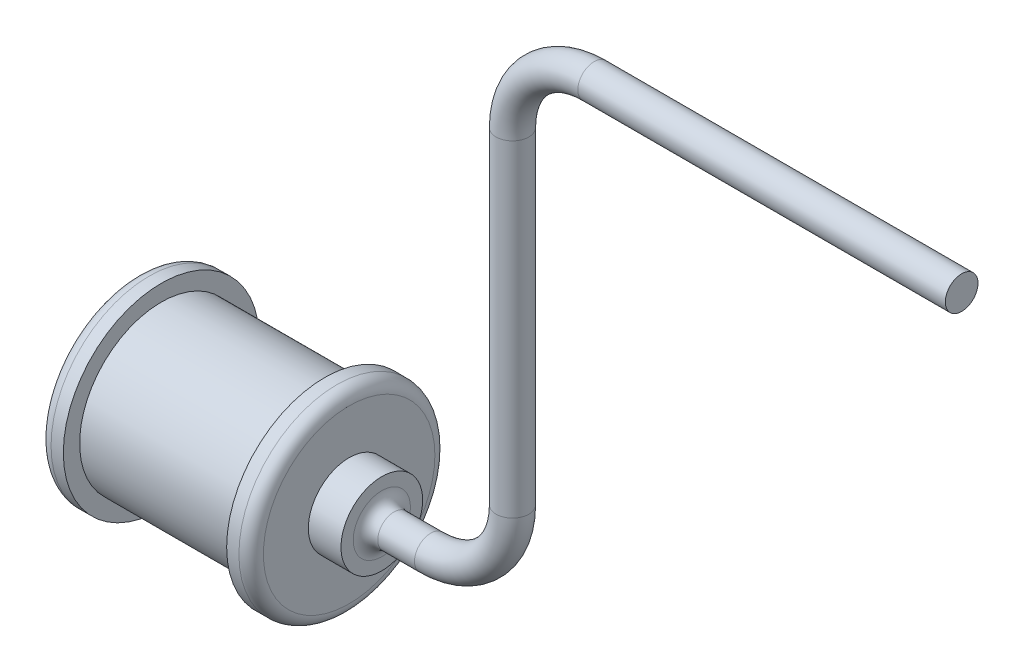
ISO-10303-21;
HEADER;
FILE_DESCRIPTION(('STEP AP214'),'2;1');
FILE_NAME('part.step','',(''),(''),'','','');
FILE_SCHEMA(('AUTOMOTIVE_DESIGN { 1 0 10303 214 1 1 1 1 }'));
ENDSEC;
DATA;
#1=APPLICATION_CONTEXT('core data for automotive mechanical design processes');
#2=APPLICATION_PROTOCOL_DEFINITION('international standard','automotive_design',2000,#1);
#3=PRODUCT_CONTEXT('',#1,'mechanical');
#4=PRODUCT('Part','Part','',(#3));
#5=PRODUCT_RELATED_PRODUCT_CATEGORY('part','',(#4));
#6=PRODUCT_DEFINITION_FORMATION('','',#4);
#7=PRODUCT_DEFINITION_CONTEXT('part definition',#1,'design');
#8=PRODUCT_DEFINITION('design','',#6,#7);
#9=PRODUCT_DEFINITION_SHAPE('','',#8);
#10=(LENGTH_UNIT() NAMED_UNIT(*) SI_UNIT(.MILLI.,.METRE.));
#11=(NAMED_UNIT(*) PLANE_ANGLE_UNIT() SI_UNIT($,.RADIAN.));
#12=(NAMED_UNIT(*) SI_UNIT($,.STERADIAN.) SOLID_ANGLE_UNIT());
#13=UNCERTAINTY_MEASURE_WITH_UNIT(LENGTH_MEASURE(1.E-05),#10,'distance_accuracy_value','');
#14=(GEOMETRIC_REPRESENTATION_CONTEXT(3) GLOBAL_UNCERTAINTY_ASSIGNED_CONTEXT((#13)) GLOBAL_UNIT_ASSIGNED_CONTEXT((#10,
#11,#12)) REPRESENTATION_CONTEXT('',''));
#15=CARTESIAN_POINT('',(0.,0.,0.));
#16=DIRECTION('',(0.,0.,1.));
#17=DIRECTION('',(1.,0.,0.));
#18=AXIS2_PLACEMENT_3D('',#15,#16,#17);
#19=CARTESIAN_POINT('',(3.81,0.,0.));
#20=DIRECTION('',(-1.,0.,0.));
#21=DIRECTION('',(0.,0.,1.));
#22=AXIS2_PLACEMENT_3D('',#19,#20,#21);
#23=CYLINDRICAL_SURFACE('',#22,15.24);
#24=CARTESIAN_POINT('',(1.905,0.,0.));
#25=DIRECTION('',(1.,0.,0.));
#26=DIRECTION('',(0.,0.,-1.));
#27=AXIS2_PLACEMENT_3D('',#24,#25,#26);
#28=CIRCLE('',#27,15.24);
#29=CARTESIAN_POINT('',(1.905,0.,15.24));
#30=VERTEX_POINT('',#29);
#31=EDGE_CURVE('E69',#30,#30,#28,.T.);
#32=CARTESIAN_POINT('',(3.81,0.,0.));
#33=DIRECTION('',(1.,0.,0.));
#34=DIRECTION('',(0.,0.,-1.));
#35=AXIS2_PLACEMENT_3D('',#32,#33,#34);
#36=CIRCLE('',#35,15.24);
#37=CARTESIAN_POINT('',(3.81,0.,15.24));
#38=VERTEX_POINT('',#37);
#39=EDGE_CURVE('E74',#38,#38,#36,.T.);
#40=CARTESIAN_POINT('',(1.905,0.,15.24));
#41=CARTESIAN_POINT('',(1.92484375,0.,15.24));
#42=CARTESIAN_POINT('',(1.9446875,0.,15.24));
#43=CARTESIAN_POINT('',(1.984375,0.,15.24));
#44=CARTESIAN_POINT('',(2.00421875,0.,15.24));
#45=CARTESIAN_POINT('',(2.04390625,0.,15.24));
#46=CARTESIAN_POINT('',(2.06375,0.,15.24));
#47=CARTESIAN_POINT('',(2.1034375,0.,15.24));
#48=CARTESIAN_POINT('',(2.12328125,0.,15.24));
#49=CARTESIAN_POINT('',(2.16296875,0.,15.24));
#50=CARTESIAN_POINT('',(2.1828125,0.,15.24));
#51=CARTESIAN_POINT('',(2.2225,0.,15.24));
#52=CARTESIAN_POINT('',(2.24234375,0.,15.24));
#53=CARTESIAN_POINT('',(2.28203125,0.,15.24));
#54=CARTESIAN_POINT('',(2.301875,0.,15.24));
#55=CARTESIAN_POINT('',(2.3415625,0.,15.24));
#56=CARTESIAN_POINT('',(2.36140625,0.,15.24));
#57=CARTESIAN_POINT('',(2.40109375,0.,15.24));
#58=CARTESIAN_POINT('',(2.4209375,0.,15.24));
#59=CARTESIAN_POINT('',(2.460625,0.,15.24));
#60=CARTESIAN_POINT('',(2.48046875,0.,15.24));
#61=CARTESIAN_POINT('',(2.52015625,0.,15.24));
#62=CARTESIAN_POINT('',(2.54,0.,15.24));
#63=CARTESIAN_POINT('',(2.5796875,0.,15.24));
#64=CARTESIAN_POINT('',(2.59953125,0.,15.24));
#65=CARTESIAN_POINT('',(2.63921875,0.,15.24));
#66=CARTESIAN_POINT('',(2.6590625,0.,15.24));
#67=CARTESIAN_POINT('',(2.69875,0.,15.24));
#68=CARTESIAN_POINT('',(2.71859375,0.,15.24));
#69=CARTESIAN_POINT('',(2.75828125,0.,15.24));
#70=CARTESIAN_POINT('',(2.778125,0.,15.24));
#71=CARTESIAN_POINT('',(2.8178125,0.,15.24));
#72=CARTESIAN_POINT('',(2.83765625,0.,15.24));
#73=CARTESIAN_POINT('',(2.87734375,0.,15.24));
#74=CARTESIAN_POINT('',(2.8971875,0.,15.24));
#75=CARTESIAN_POINT('',(2.936875,0.,15.24));
#76=CARTESIAN_POINT('',(2.95671875,0.,15.24));
#77=CARTESIAN_POINT('',(2.99640625,0.,15.24));
#78=CARTESIAN_POINT('',(3.01625,0.,15.24));
#79=CARTESIAN_POINT('',(3.0559375,0.,15.24));
#80=CARTESIAN_POINT('',(3.07578125,0.,15.24));
#81=CARTESIAN_POINT('',(3.11546875,0.,15.24));
#82=CARTESIAN_POINT('',(3.1353125,0.,15.24));
#83=CARTESIAN_POINT('',(3.175,0.,15.24));
#84=CARTESIAN_POINT('',(3.19484375,0.,15.24));
#85=CARTESIAN_POINT('',(3.23453125,0.,15.24));
#86=CARTESIAN_POINT('',(3.254375,0.,15.24));
#87=CARTESIAN_POINT('',(3.2940625,0.,15.24));
#88=CARTESIAN_POINT('',(3.31390625,0.,15.24));
#89=CARTESIAN_POINT('',(3.35359375,0.,15.24));
#90=CARTESIAN_POINT('',(3.3734375,0.,15.24));
#91=CARTESIAN_POINT('',(3.413125,0.,15.24));
#92=CARTESIAN_POINT('',(3.43296875,0.,15.24));
#93=CARTESIAN_POINT('',(3.47265625,0.,15.24));
#94=CARTESIAN_POINT('',(3.4925,0.,15.24));
#95=CARTESIAN_POINT('',(3.5321875,0.,15.24));
#96=CARTESIAN_POINT('',(3.55203125,0.,15.24));
#97=CARTESIAN_POINT('',(3.59171875,0.,15.24));
#98=CARTESIAN_POINT('',(3.6115625,0.,15.24));
#99=CARTESIAN_POINT('',(3.65125,0.,15.24));
#100=CARTESIAN_POINT('',(3.67109375,0.,15.24));
#101=CARTESIAN_POINT('',(3.71078125,0.,15.24));
#102=CARTESIAN_POINT('',(3.730625,0.,15.24));
#103=CARTESIAN_POINT('',(3.7703125,0.,15.24));
#104=CARTESIAN_POINT('',(3.79015625,0.,15.24));
#105=CARTESIAN_POINT('',(3.81,0.,15.24));
#106=B_SPLINE_CURVE_WITH_KNOTS('',3,(#40,#41,#42,#43,#44,#45,#46,#47,#48,#49,#50,#51,#52,#53,
#54,#55,#56,#57,#58,#59,#60,#61,#62,#63,#64,#65,#66,#67,#68,#69,#70,#71,#72,#73,#74,#75,#76,#77,
#78,#79,#80,#81,#82,#83,#84,#85,#86,#87,#88,#89,#90,#91,#92,#93,#94,#95,#96,#97,#98,#99,#100,
#101,#102,#103,#104,#105),.UNSPECIFIED.,.F.,.F.,(4,2,2,2,2,2,2,2,2,2,2,2,2,2,2,2,2,2,2,2,2,2,2,
2,2,2,2,2,2,2,2,2,4),(0.,0.0595312499999999,0.1190625,0.17859375,0.238125,0.29765625,0.3571875,
0.41671875,0.47625,0.53578125,0.5953125,0.65484375,0.714375,0.77390625,0.8334375,0.89296875,
0.9525,1.01203125,1.0715625,1.13109375,1.190625,1.25015625,1.3096875,1.36921875,1.42875,
1.48828125,1.5478125,1.60734375,1.666875,1.72640625,1.7859375,1.84546875,1.905),.UNSPECIFIED.);
#107=EDGE_CURVE('BSEAM37',#30,#38,#106,.T.);
#108=ORIENTED_EDGE('',*,*,#31,.T.);
#109=ORIENTED_EDGE('',*,*,#39,.F.);
#110=ORIENTED_EDGE('',*,*,#107,.T.);
#111=ORIENTED_EDGE('',*,*,#107,.F.);
#112=EDGE_LOOP('',(#108,#110,#109,#111));
#113=FACE_BOUND('',#112,.T.);
#114=ADVANCED_FACE('F37',(#113),#23,.T.);
#115=CARTESIAN_POINT('',(3.81,0.,0.));
#116=DIRECTION('',(1.,0.,0.));
#117=DIRECTION('',(0.,0.,-1.));
#118=AXIS2_PLACEMENT_3D('',#115,#116,#117);
#119=PLANE('',#118);
#120=CARTESIAN_POINT('',(3.81,0.,0.));
#121=DIRECTION('',(1.,0.,0.));
#122=DIRECTION('',(0.,0.,-1.));
#123=AXIS2_PLACEMENT_3D('',#120,#121,#122);
#124=CIRCLE('',#123,12.7);
#125=CARTESIAN_POINT('',(3.81,0.,-12.7));
#126=VERTEX_POINT('',#125);
#127=EDGE_CURVE('E73',#126,#126,#124,.T.);
#128=ORIENTED_EDGE('',*,*,#127,.F.);
#129=EDGE_LOOP('',(#128));
#130=FACE_BOUND('',#129,.T.);
#131=ORIENTED_EDGE('',*,*,#39,.T.);
#132=EDGE_LOOP('',(#131));
#133=FACE_BOUND('',#132,.T.);
#134=ADVANCED_FACE('F154',(#130,#133),#119,.T.);
#135=CARTESIAN_POINT('',(0.,0.,0.));
#136=DIRECTION('',(1.,0.,0.));
#137=DIRECTION('',(0.,0.,-1.));
#138=AXIS2_PLACEMENT_3D('',#135,#136,#137);
#139=PLANE('',#138);
#140=CARTESIAN_POINT('',(0.,0.,0.));
#141=DIRECTION('',(1.,0.,0.));
#142=DIRECTION('',(0.,0.,-1.));
#143=AXIS2_PLACEMENT_3D('',#140,#141,#142);
#144=CIRCLE('',#143,6.35);
#145=CARTESIAN_POINT('',(0.,0.,-6.35));
#146=VERTEX_POINT('',#145);
#147=EDGE_CURVE('E50',#146,#146,#144,.F.);
#148=ORIENTED_EDGE('',*,*,#147,.F.);
#149=EDGE_LOOP('',(#148));
#150=FACE_BOUND('',#149,.T.);
#151=CARTESIAN_POINT('',(0.,0.,0.));
#152=DIRECTION('',(1.,0.,0.));
#153=DIRECTION('',(0.,0.,-1.));
#154=AXIS2_PLACEMENT_3D('',#151,#152,#153);
#155=CIRCLE('',#154,13.335);
#156=CARTESIAN_POINT('',(0.,0.,-13.335));
#157=VERTEX_POINT('',#156);
#158=EDGE_CURVE('E65',#157,#157,#155,.F.);
#159=ORIENTED_EDGE('',*,*,#158,.T.);
#160=EDGE_LOOP('',(#159));
#161=FACE_BOUND('',#160,.T.);
#162=ADVANCED_FACE('F160',(#150,#161),#139,.F.);
#163=CARTESIAN_POINT('',(29.21,0.,0.));
#164=DIRECTION('',(-1.,0.,0.));
#165=DIRECTION('',(0.,0.,1.));
#166=AXIS2_PLACEMENT_3D('',#163,#164,#165);
#167=CYLINDRICAL_SURFACE('',#166,12.7);
#168=CARTESIAN_POINT('',(29.21,0.,0.));
#169=DIRECTION('',(1.,0.,0.));
#170=DIRECTION('',(0.,0.,-1.));
#171=AXIS2_PLACEMENT_3D('',#168,#169,#170);
#172=CIRCLE('',#171,12.7);
#173=CARTESIAN_POINT('',(29.21,0.,-12.7));
#174=VERTEX_POINT('',#173);
#175=EDGE_CURVE('E78',#174,#174,#172,.T.);
#176=ORIENTED_EDGE('',*,*,#175,.F.);
#177=EDGE_LOOP('',(#176));
#178=FACE_BOUND('',#177,.T.);
#179=ORIENTED_EDGE('',*,*,#127,.T.);
#180=EDGE_LOOP('',(#179));
#181=FACE_BOUND('',#180,.T.);
#182=ADVANCED_FACE('F166',(#178,#181),#167,.T.);
#183=CARTESIAN_POINT('',(33.02,0.,0.));
#184=DIRECTION('',(-1.,0.,0.));
#185=DIRECTION('',(0.,0.,1.));
#186=AXIS2_PLACEMENT_3D('',#183,#184,#185);
#187=CYLINDRICAL_SURFACE('',#186,15.24);
#188=CARTESIAN_POINT('',(31.115,0.,0.));
#189=DIRECTION('',(1.,0.,0.));
#190=DIRECTION('',(0.,0.,-1.));
#191=AXIS2_PLACEMENT_3D('',#188,#189,#190);
#192=CIRCLE('',#191,15.24);
#193=CARTESIAN_POINT('',(31.115,0.,15.24));
#194=VERTEX_POINT('',#193);
#195=EDGE_CURVE('E55',#194,#194,#192,.F.);
#196=CARTESIAN_POINT('',(29.21,0.,0.));
#197=DIRECTION('',(1.,0.,0.));
#198=DIRECTION('',(0.,0.,-1.));
#199=AXIS2_PLACEMENT_3D('',#196,#197,#198);
#200=CIRCLE('',#199,15.24);
#201=CARTESIAN_POINT('',(29.21,0.,15.24));
#202=VERTEX_POINT('',#201);
#203=EDGE_CURVE('E85',#202,#202,#200,.T.);
#204=CARTESIAN_POINT('',(31.115,0.,15.24));
#205=CARTESIAN_POINT('',(31.09515625,0.,15.24));
#206=CARTESIAN_POINT('',(31.0753125,0.,15.24));
#207=CARTESIAN_POINT('',(31.035625,0.,15.24));
#208=CARTESIAN_POINT('',(31.01578125,0.,15.24));
#209=CARTESIAN_POINT('',(30.97609375,0.,15.24));
#210=CARTESIAN_POINT('',(30.95625,0.,15.24));
#211=CARTESIAN_POINT('',(30.9165625,0.,15.24));
#212=CARTESIAN_POINT('',(30.89671875,0.,15.24));
#213=CARTESIAN_POINT('',(30.85703125,0.,15.24));
#214=CARTESIAN_POINT('',(30.8371875,0.,15.24));
#215=CARTESIAN_POINT('',(30.7975,0.,15.24));
#216=CARTESIAN_POINT('',(30.77765625,0.,15.24));
#217=CARTESIAN_POINT('',(30.73796875,0.,15.24));
#218=CARTESIAN_POINT('',(30.718125,0.,15.24));
#219=CARTESIAN_POINT('',(30.6784375,0.,15.24));
#220=CARTESIAN_POINT('',(30.65859375,0.,15.24));
#221=CARTESIAN_POINT('',(30.61890625,0.,15.24));
#222=CARTESIAN_POINT('',(30.5990625,0.,15.24));
#223=CARTESIAN_POINT('',(30.559375,0.,15.24));
#224=CARTESIAN_POINT('',(30.53953125,0.,15.24));
#225=CARTESIAN_POINT('',(30.49984375,0.,15.24));
#226=CARTESIAN_POINT('',(30.48,0.,15.24));
#227=CARTESIAN_POINT('',(30.4403125,0.,15.24));
#228=CARTESIAN_POINT('',(30.42046875,0.,15.24));
#229=CARTESIAN_POINT('',(30.38078125,0.,15.24));
#230=CARTESIAN_POINT('',(30.3609375,0.,15.24));
#231=CARTESIAN_POINT('',(30.32125,0.,15.24));
#232=CARTESIAN_POINT('',(30.30140625,0.,15.24));
#233=CARTESIAN_POINT('',(30.26171875,0.,15.24));
#234=CARTESIAN_POINT('',(30.241875,0.,15.24));
#235=CARTESIAN_POINT('',(30.2021875,0.,15.24));
#236=CARTESIAN_POINT('',(30.18234375,0.,15.24));
#237=CARTESIAN_POINT('',(30.14265625,0.,15.24));
#238=CARTESIAN_POINT('',(30.1228125,0.,15.24));
#239=CARTESIAN_POINT('',(30.083125,0.,15.24));
#240=CARTESIAN_POINT('',(30.06328125,0.,15.24));
#241=CARTESIAN_POINT('',(30.02359375,0.,15.24));
#242=CARTESIAN_POINT('',(30.00375,0.,15.24));
#243=CARTESIAN_POINT('',(29.9640625,0.,15.24));
#244=CARTESIAN_POINT('',(29.94421875,0.,15.24));
#245=CARTESIAN_POINT('',(29.90453125,0.,15.24));
#246=CARTESIAN_POINT('',(29.8846875,0.,15.24));
#247=CARTESIAN_POINT('',(29.845,0.,15.24));
#248=CARTESIAN_POINT('',(29.82515625,0.,15.24));
#249=CARTESIAN_POINT('',(29.78546875,0.,15.24));
#250=CARTESIAN_POINT('',(29.765625,0.,15.24));
#251=CARTESIAN_POINT('',(29.7259375,0.,15.24));
#252=CARTESIAN_POINT('',(29.70609375,0.,15.24));
#253=CARTESIAN_POINT('',(29.66640625,0.,15.24));
#254=CARTESIAN_POINT('',(29.6465625,0.,15.24));
#255=CARTESIAN_POINT('',(29.606875,0.,15.24));
#256=CARTESIAN_POINT('',(29.58703125,0.,15.24));
#257=CARTESIAN_POINT('',(29.54734375,0.,15.24));
#258=CARTESIAN_POINT('',(29.5275,0.,15.24));
#259=CARTESIAN_POINT('',(29.4878125,0.,15.24));
#260=CARTESIAN_POINT('',(29.46796875,0.,15.24));
#261=CARTESIAN_POINT('',(29.42828125,0.,15.24));
#262=CARTESIAN_POINT('',(29.4084375,0.,15.24));
#263=CARTESIAN_POINT('',(29.36875,0.,15.24));
#264=CARTESIAN_POINT('',(29.34890625,0.,15.24));
#265=CARTESIAN_POINT('',(29.30921875,0.,15.24));
#266=CARTESIAN_POINT('',(29.289375,0.,15.24));
#267=CARTESIAN_POINT('',(29.2496875,0.,15.24));
#268=CARTESIAN_POINT('',(29.22984375,0.,15.24));
#269=CARTESIAN_POINT('',(29.21,0.,15.24));
#270=B_SPLINE_CURVE_WITH_KNOTS('',3,(#204,#205,#206,#207,#208,#209,#210,#211,#212,#213,#214,
#215,#216,#217,#218,#219,#220,#221,#222,#223,#224,#225,#226,#227,#228,#229,#230,#231,#232,#233,
#234,#235,#236,#237,#238,#239,#240,#241,#242,#243,#244,#245,#246,#247,#248,#249,#250,#251,#252,
#253,#254,#255,#256,#257,#258,#259,#260,#261,#262,#263,#264,#265,#266,#267,#268,#269),
.UNSPECIFIED.,.F.,.F.,(4,2,2,2,2,2,2,2,2,2,2,2,2,2,2,2,2,2,2,2,2,2,2,2,2,2,2,2,2,2,2,2,4),(0.,
0.0595312500000014,0.119062500000003,0.178593750000001,0.238125000000002,0.29765625,
0.357187500000002,0.416718750000003,0.476250000000001,0.535781250000002,0.5953125,
0.654843750000002,0.714375000000003,0.773906250000001,0.833437500000003,0.892968750000001,
0.952500000000002,1.01203125,1.0715625,1.13109375,1.190625,1.25015625,1.3096875,1.36921875,
1.42875,1.48828125,1.5478125,1.60734375,1.666875,1.72640625,1.7859375,1.84546875,1.905),.UNSPECIFIED.);
#271=EDGE_CURVE('BSEAM135',#194,#202,#270,.T.);
#272=ORIENTED_EDGE('',*,*,#195,.T.);
#273=ORIENTED_EDGE('',*,*,#203,.T.);
#274=ORIENTED_EDGE('',*,*,#271,.T.);
#275=ORIENTED_EDGE('',*,*,#271,.F.);
#276=EDGE_LOOP('',(#272,#274,#273,#275));
#277=FACE_BOUND('',#276,.T.);
#278=ADVANCED_FACE('F135',(#277),#187,.T.);
#279=CARTESIAN_POINT('',(33.02,0.,0.));
#280=DIRECTION('',(1.,0.,0.));
#281=DIRECTION('',(0.,0.,-1.));
#282=AXIS2_PLACEMENT_3D('',#279,#280,#281);
#283=PLANE('',#282);
#284=CARTESIAN_POINT('',(33.02,0.,0.));
#285=DIRECTION('',(1.,0.,0.));
#286=DIRECTION('',(0.,0.,-1.));
#287=AXIS2_PLACEMENT_3D('',#284,#285,#286);
#288=CIRCLE('',#287,6.35);
#289=CARTESIAN_POINT('',(33.02,0.,-6.35));
#290=VERTEX_POINT('',#289);
#291=EDGE_CURVE('E114',#290,#290,#288,.T.);
#292=ORIENTED_EDGE('',*,*,#291,.F.);
#293=EDGE_LOOP('',(#292));
#294=FACE_BOUND('',#293,.T.);
#295=CARTESIAN_POINT('',(33.02,0.,0.));
#296=DIRECTION('',(1.,0.,0.));
#297=DIRECTION('',(0.,0.,-1.));
#298=AXIS2_PLACEMENT_3D('',#295,#296,#297);
#299=CIRCLE('',#298,13.335);
#300=CARTESIAN_POINT('',(33.02,0.,-13.335));
#301=VERTEX_POINT('',#300);
#302=EDGE_CURVE('E61',#301,#301,#299,.T.);
#303=ORIENTED_EDGE('',*,*,#302,.T.);
#304=EDGE_LOOP('',(#303));
#305=FACE_BOUND('',#304,.T.);
#306=ADVANCED_FACE('F131',(#294,#305),#283,.T.);
#307=CARTESIAN_POINT('',(29.21,0.,0.));
#308=DIRECTION('',(1.,0.,0.));
#309=DIRECTION('',(0.,0.,-1.));
#310=AXIS2_PLACEMENT_3D('',#307,#308,#309);
#311=PLANE('',#310);
#312=ORIENTED_EDGE('',*,*,#175,.T.);
#313=EDGE_LOOP('',(#312));
#314=FACE_BOUND('',#313,.T.);
#315=ORIENTED_EDGE('',*,*,#203,.F.);
#316=EDGE_LOOP('',(#315));
#317=FACE_BOUND('',#316,.T.);
#318=ADVANCED_FACE('F134',(#314,#317),#311,.F.);
#319=CARTESIAN_POINT('',(1.905,0.,0.));
#320=DIRECTION('',(1.,0.,0.));
#321=DIRECTION('',(0.,0.,-1.));
#322=AXIS2_PLACEMENT_3D('',#319,#320,#321);
#323=TOROIDAL_SURFACE('',#322,13.335,1.905);
#324=ORIENTED_EDGE('',*,*,#158,.F.);
#325=EDGE_LOOP('',(#324));
#326=FACE_BOUND('',#325,.T.);
#327=ORIENTED_EDGE('',*,*,#31,.F.);
#328=EDGE_LOOP('',(#327));
#329=FACE_BOUND('',#328,.T.);
#330=ADVANCED_FACE('F142',(#326,#329),#323,.T.);
#331=CARTESIAN_POINT('',(31.115,0.,0.));
#332=DIRECTION('',(1.,0.,0.));
#333=DIRECTION('',(0.,0.,-1.));
#334=AXIS2_PLACEMENT_3D('',#331,#332,#333);
#335=TOROIDAL_SURFACE('',#334,13.335,1.905);
#336=ORIENTED_EDGE('',*,*,#195,.F.);
#337=EDGE_LOOP('',(#336));
#338=FACE_BOUND('',#337,.T.);
#339=ORIENTED_EDGE('',*,*,#302,.F.);
#340=EDGE_LOOP('',(#339));
#341=FACE_BOUND('',#340,.T.);
#342=ADVANCED_FACE('F139',(#338,#341),#335,.T.);
#343=CARTESIAN_POINT('',(-5.08,0.,0.));
#344=DIRECTION('',(1.,0.,0.));
#345=DIRECTION('',(0.,0.,-1.));
#346=AXIS2_PLACEMENT_3D('',#343,#344,#345);
#347=CYLINDRICAL_SURFACE('',#346,6.35);
#348=CARTESIAN_POINT('',(-5.08,0.,0.));
#349=DIRECTION('',(-1.,0.,0.));
#350=DIRECTION('',(0.,0.,1.));
#351=AXIS2_PLACEMENT_3D('',#348,#349,#350);
#352=CIRCLE('',#351,6.35);
#353=CARTESIAN_POINT('',(-5.08,0.,6.35));
#354=VERTEX_POINT('',#353);
#355=EDGE_CURVE('E109',#354,#354,#352,.T.);
#356=ORIENTED_EDGE('',*,*,#355,.F.);
#357=EDGE_LOOP('',(#356));
#358=FACE_BOUND('',#357,.T.);
#359=ORIENTED_EDGE('',*,*,#147,.T.);
#360=EDGE_LOOP('',(#359));
#361=FACE_BOUND('',#360,.T.);
#362=ADVANCED_FACE('F141',(#358,#361),#347,.T.);
#363=CARTESIAN_POINT('',(-5.08,0.,0.));
#364=DIRECTION('',(-1.,0.,0.));
#365=DIRECTION('',(0.,0.,1.));
#366=AXIS2_PLACEMENT_3D('',#363,#364,#365);
#367=PLANE('',#366);
#368=ORIENTED_EDGE('',*,*,#355,.T.);
#369=EDGE_LOOP('',(#368));
#370=FACE_BOUND('',#369,.T.);
#371=ADVANCED_FACE('F127',(#370),#367,.T.);
#372=CARTESIAN_POINT('',(38.1,0.,0.));
#373=DIRECTION('',(-1.,0.,0.));
#374=DIRECTION('',(0.,0.,1.));
#375=AXIS2_PLACEMENT_3D('',#372,#373,#374);
#376=CYLINDRICAL_SURFACE('',#375,6.35);
#377=CARTESIAN_POINT('',(38.1,0.,0.));
#378=DIRECTION('',(1.,0.,0.));
#379=DIRECTION('',(0.,0.,-1.));
#380=AXIS2_PLACEMENT_3D('',#377,#378,#379);
#381=CIRCLE('',#380,6.35);
#382=CARTESIAN_POINT('',(38.1,0.,-6.35));
#383=VERTEX_POINT('',#382);
#384=EDGE_CURVE('E113',#383,#383,#381,.T.);
#385=ORIENTED_EDGE('',*,*,#384,.F.);
#386=EDGE_LOOP('',(#385));
#387=FACE_BOUND('',#386,.T.);
#388=ORIENTED_EDGE('',*,*,#291,.T.);
#389=EDGE_LOOP('',(#388));
#390=FACE_BOUND('',#389,.T.);
#391=ADVANCED_FACE('F124',(#387,#390),#376,.T.);
#392=CARTESIAN_POINT('',(38.1,0.,0.));
#393=DIRECTION('',(1.,0.,0.));
#394=DIRECTION('',(0.,0.,-1.));
#395=AXIS2_PLACEMENT_3D('',#392,#393,#394);
#396=PLANE('',#395);
#397=CARTESIAN_POINT('',(38.1,0.,0.));
#398=DIRECTION('',(1.,0.,0.));
#399=DIRECTION('',(0.,0.,-1.));
#400=AXIS2_PLACEMENT_3D('',#397,#398,#399);
#401=CIRCLE('',#400,4.445);
#402=CARTESIAN_POINT('',(38.1,0.,-4.445));
#403=VERTEX_POINT('',#402);
#404=EDGE_CURVE('E45',#403,#403,#401,.F.);
#405=ORIENTED_EDGE('',*,*,#404,.T.);
#406=EDGE_LOOP('',(#405));
#407=FACE_BOUND('',#406,.T.);
#408=ORIENTED_EDGE('',*,*,#384,.T.);
#409=EDGE_LOOP('',(#408));
#410=FACE_BOUND('',#409,.T.);
#411=ADVANCED_FACE('F122',(#407,#410),#396,.T.);
#412=CARTESIAN_POINT('',(128.27,76.2,0.));
#413=DIRECTION('',(1.,0.,0.));
#414=DIRECTION('',(0.,0.,-1.));
#415=AXIS2_PLACEMENT_3D('',#412,#413,#414);
#416=PLANE('',#415);
#417=CARTESIAN_POINT('',(128.27,76.2,0.));
#418=DIRECTION('',(1.,0.,0.));
#419=DIRECTION('',(0.,0.,-1.));
#420=AXIS2_PLACEMENT_3D('',#417,#418,#419);
#421=CIRCLE('',#420,2.54);
#422=CARTESIAN_POINT('',(128.27,76.2,-2.54));
#423=VERTEX_POINT('',#422);
#424=EDGE_CURVE('E89',#423,#423,#421,.T.);
#425=ORIENTED_EDGE('',*,*,#424,.T.);
#426=EDGE_LOOP('',(#425));
#427=FACE_BOUND('',#426,.T.);
#428=ADVANCED_FACE('F178',(#427),#416,.T.);
#429=CARTESIAN_POINT('',(71.12,76.2,0.));
#430=DIRECTION('',(1.,0.,0.));
#431=DIRECTION('',(0.,0.,-1.));
#432=AXIS2_PLACEMENT_3D('',#429,#430,#431);
#433=CYLINDRICAL_SURFACE('',#432,2.54);
#434=ORIENTED_EDGE('',*,*,#424,.F.);
#435=EDGE_LOOP('',(#434));
#436=FACE_BOUND('',#435,.T.);
#437=CARTESIAN_POINT('',(71.12,76.2,0.));
#438=DIRECTION('',(1.,0.,0.));
#439=DIRECTION('',(0.,0.,-1.));
#440=AXIS2_PLACEMENT_3D('',#437,#438,#439);
#441=CIRCLE('',#440,2.54);
#442=CARTESIAN_POINT('',(71.12,78.74,0.));
#443=VERTEX_POINT('',#442);
#444=EDGE_CURVE('E93',#443,#443,#441,.T.);
#445=ORIENTED_EDGE('',*,*,#444,.T.);
#446=EDGE_LOOP('',(#445));
#447=FACE_BOUND('',#446,.T.);
#448=ADVANCED_FACE('F181',(#436,#447),#433,.T.);
#449=CARTESIAN_POINT('',(71.12,63.5,0.));
#450=DIRECTION('',(0.,0.,-1.));
#451=DIRECTION('',(-1.,0.,0.));
#452=AXIS2_PLACEMENT_3D('',#449,#450,#451);
#453=TOROIDAL_SURFACE('',#452,12.7,2.54);
#454=CARTESIAN_POINT('',(58.42,63.5,0.));
#455=DIRECTION('',(0.,1.,0.));
#456=DIRECTION('',(0.,0.,-1.));
#457=AXIS2_PLACEMENT_3D('',#454,#455,#456);
#458=CIRCLE('',#457,2.54);
#459=CARTESIAN_POINT('',(55.88,63.5,0.));
#460=VERTEX_POINT('',#459);
#461=EDGE_CURVE('E97',#460,#460,#458,.T.);
#462=CARTESIAN_POINT('',(71.12,63.5,0.));
#463=DIRECTION('',(0.,0.,-1.));
#464=DIRECTION('',(-1.,0.,0.));
#465=AXIS2_PLACEMENT_3D('',#462,#463,#464);
#466=CIRCLE('',#465,15.24);
#467=EDGE_CURVE('',#460,#443,#466,.T.);
#468=ORIENTED_EDGE('',*,*,#461,.T.);
#469=ORIENTED_EDGE('',*,*,#444,.F.);
#470=ORIENTED_EDGE('',*,*,#467,.T.);
#471=ORIENTED_EDGE('',*,*,#467,.F.);
#472=EDGE_LOOP('',(#468,#470,#469,#471));
#473=FACE_BOUND('',#472,.T.);
#474=ADVANCED_FACE('F185',(#473),#453,.T.);
#475=CARTESIAN_POINT('',(58.42,12.7,0.));
#476=DIRECTION('',(0.,1.,0.));
#477=DIRECTION('',(0.,0.,1.));
#478=AXIS2_PLACEMENT_3D('',#475,#476,#477);
#479=CYLINDRICAL_SURFACE('',#478,2.54);
#480=ORIENTED_EDGE('',*,*,#461,.F.);
#481=EDGE_LOOP('',(#480));
#482=FACE_BOUND('',#481,.T.);
#483=CARTESIAN_POINT('',(58.42,12.7,0.));
#484=DIRECTION('',(0.,1.,0.));
#485=DIRECTION('',(0.,0.,-1.));
#486=AXIS2_PLACEMENT_3D('',#483,#484,#485);
#487=CIRCLE('',#486,2.54);
#488=CARTESIAN_POINT('',(60.96,12.7,0.));
#489=VERTEX_POINT('',#488);
#490=EDGE_CURVE('E101',#489,#489,#487,.T.);
#491=ORIENTED_EDGE('',*,*,#490,.T.);
#492=EDGE_LOOP('',(#491));
#493=FACE_BOUND('',#492,.T.);
#494=ADVANCED_FACE('F189',(#482,#493),#479,.T.);
#495=CARTESIAN_POINT('',(45.72,12.7,0.));
#496=DIRECTION('',(0.,0.,1.));
#497=DIRECTION('',(1.,0.,0.));
#498=AXIS2_PLACEMENT_3D('',#495,#496,#497);
#499=TOROIDAL_SURFACE('',#498,12.7,2.54);
#500=CARTESIAN_POINT('',(45.72,0.,0.));
#501=DIRECTION('',(1.,0.,0.));
#502=DIRECTION('',(0.,0.,-1.));
#503=AXIS2_PLACEMENT_3D('',#500,#501,#502);
#504=CIRCLE('',#503,2.54);
#505=CARTESIAN_POINT('',(45.72,-2.54,0.));
#506=VERTEX_POINT('',#505);
#507=EDGE_CURVE('E105',#506,#506,#504,.T.);
#508=CARTESIAN_POINT('',(45.72,12.7,0.));
#509=DIRECTION('',(0.,0.,1.));
#510=DIRECTION('',(1.,0.,0.));
#511=AXIS2_PLACEMENT_3D('',#508,#509,#510);
#512=CIRCLE('',#511,15.24);
#513=EDGE_CURVE('',#506,#489,#512,.T.);
#514=ORIENTED_EDGE('',*,*,#507,.T.);
#515=ORIENTED_EDGE('',*,*,#490,.F.);
#516=ORIENTED_EDGE('',*,*,#513,.T.);
#517=ORIENTED_EDGE('',*,*,#513,.F.);
#518=EDGE_LOOP('',(#514,#516,#515,#517));
#519=FACE_BOUND('',#518,.T.);
#520=ADVANCED_FACE('F193',(#519),#499,.T.);
#521=CARTESIAN_POINT('',(33.02,0.,0.));
#522=DIRECTION('',(1.,0.,0.));
#523=DIRECTION('',(0.,0.,-1.));
#524=AXIS2_PLACEMENT_3D('',#521,#522,#523);
#525=CYLINDRICAL_SURFACE('',#524,2.54);
#526=CARTESIAN_POINT('',(40.005,0.,0.));
#527=DIRECTION('',(1.,0.,0.));
#528=DIRECTION('',(0.,0.,-1.));
#529=AXIS2_PLACEMENT_3D('',#526,#527,#528);
#530=CIRCLE('',#529,2.54);
#531=CARTESIAN_POINT('',(40.005,0.,-2.54));
#532=VERTEX_POINT('',#531);
#533=EDGE_CURVE('E10',#532,#532,#530,.T.);
#534=ORIENTED_EDGE('',*,*,#533,.T.);
#535=EDGE_LOOP('',(#534));
#536=FACE_BOUND('',#535,.T.);
#537=ORIENTED_EDGE('',*,*,#507,.F.);
#538=EDGE_LOOP('',(#537));
#539=FACE_BOUND('',#538,.T.);
#540=ADVANCED_FACE('F197',(#536,#539),#525,.T.);
#541=CARTESIAN_POINT('',(40.005,0.,0.));
#542=DIRECTION('',(1.,0.,0.));
#543=DIRECTION('',(0.,0.,-1.));
#544=AXIS2_PLACEMENT_3D('',#541,#542,#543);
#545=TOROIDAL_SURFACE('',#544,4.445,1.905);
#546=ORIENTED_EDGE('',*,*,#533,.F.);
#547=EDGE_LOOP('',(#546));
#548=FACE_BOUND('',#547,.T.);
#549=ORIENTED_EDGE('',*,*,#404,.F.);
#550=EDGE_LOOP('',(#549));
#551=FACE_BOUND('',#550,.T.);
#552=ADVANCED_FACE('F39',(#548,#551),#545,.F.);
#553=CLOSED_SHELL('',(#114,#134,#162,#182,#278,#306,#318,#330,#342,#362,#371,#391,#411,#428,
#448,#474,#494,#520,#540,#552));
#554=MANIFOLD_SOLID_BREP('B2',#553);
#555=ADVANCED_BREP_SHAPE_REPRESENTATION('',(#18,#554),#14);
#556=SHAPE_DEFINITION_REPRESENTATION(#9,#555);
ENDSEC;
END-ISO-10303-21;
